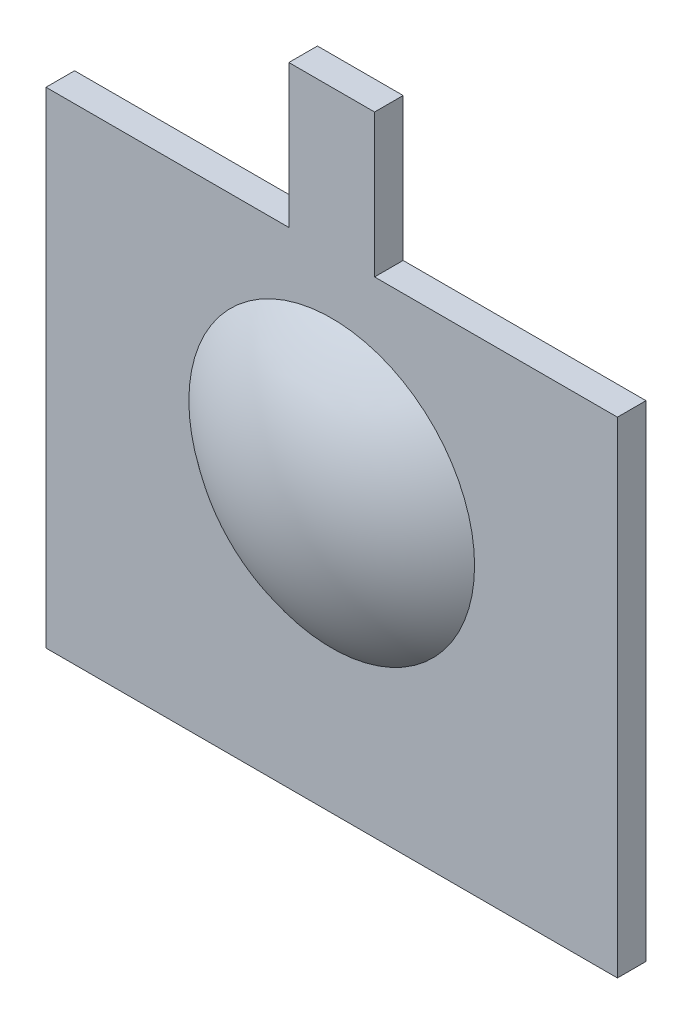
ISO-10303-21;
HEADER;
FILE_DESCRIPTION(('STEP AP214'),'2;1');
FILE_NAME('part.step','',(''),(''),'','','');
FILE_SCHEMA(('AUTOMOTIVE_DESIGN { 1 0 10303 214 1 1 1 1 }'));
ENDSEC;
DATA;
#1=APPLICATION_CONTEXT('core data for automotive mechanical design processes');
#2=APPLICATION_PROTOCOL_DEFINITION('international standard','automotive_design',2000,#1);
#3=PRODUCT_CONTEXT('',#1,'mechanical');
#4=PRODUCT('Part','Part','',(#3));
#5=PRODUCT_RELATED_PRODUCT_CATEGORY('part','',(#4));
#6=PRODUCT_DEFINITION_FORMATION('','',#4);
#7=PRODUCT_DEFINITION_CONTEXT('part definition',#1,'design');
#8=PRODUCT_DEFINITION('design','',#6,#7);
#9=PRODUCT_DEFINITION_SHAPE('','',#8);
#10=(LENGTH_UNIT() NAMED_UNIT(*) SI_UNIT(.MILLI.,.METRE.));
#11=(NAMED_UNIT(*) PLANE_ANGLE_UNIT() SI_UNIT($,.RADIAN.));
#12=(NAMED_UNIT(*) SI_UNIT($,.STERADIAN.) SOLID_ANGLE_UNIT());
#13=UNCERTAINTY_MEASURE_WITH_UNIT(LENGTH_MEASURE(1.E-05),#10,'distance_accuracy_value','');
#14=(GEOMETRIC_REPRESENTATION_CONTEXT(3) GLOBAL_UNCERTAINTY_ASSIGNED_CONTEXT((#13)) GLOBAL_UNIT_ASSIGNED_CONTEXT((#10,
#11,#12)) REPRESENTATION_CONTEXT('',''));
#15=CARTESIAN_POINT('',(0.,0.,0.));
#16=DIRECTION('',(0.,0.,1.));
#17=DIRECTION('',(1.,0.,0.));
#18=AXIS2_PLACEMENT_3D('',#15,#16,#17);
#19=CARTESIAN_POINT('',(0.,10.45,0.));
#20=DIRECTION('',(0.,1.,0.));
#21=DIRECTION('',(0.,0.,1.));
#22=AXIS2_PLACEMENT_3D('',#19,#20,#21);
#23=PLANE('',#22);
#24=DIRECTION('',(0.,0.,1.));
#25=VECTOR('',#24,1.);
#26=CARTESIAN_POINT('',(13.55,10.45,-65.35));
#27=LINE('',#26,#25);
#28=CARTESIAN_POINT('',(13.55,10.45,-65.35));
#29=VERTEX_POINT('',#28);
#30=CARTESIAN_POINT('',(13.55,10.45,-64.85));
#31=VERTEX_POINT('',#30);
#32=EDGE_CURVE('E56',#29,#31,#27,.T.);
#33=ORIENTED_EDGE('',*,*,#32,.F.);
#34=DIRECTION('',(-1.,0.,0.));
#35=VECTOR('',#34,1.);
#36=CARTESIAN_POINT('',(19.3,10.45,-65.35));
#37=LINE('',#36,#35);
#38=CARTESIAN_POINT('',(9.3,10.45,-65.35));
#39=VERTEX_POINT('',#38);
#40=EDGE_CURVE('E145',#29,#39,#37,.T.);
#41=ORIENTED_EDGE('',*,*,#40,.T.);
#42=DIRECTION('',(0.,0.,1.));
#43=VECTOR('',#42,1.);
#44=CARTESIAN_POINT('',(9.3,10.45,-65.35));
#45=LINE('',#44,#43);
#46=CARTESIAN_POINT('',(9.3,10.45,-64.85));
#47=VERTEX_POINT('',#46);
#48=EDGE_CURVE('E136',#39,#47,#45,.T.);
#49=ORIENTED_EDGE('',*,*,#48,.T.);
#50=DIRECTION('',(1.,0.,0.));
#51=VECTOR('',#50,1.);
#52=CARTESIAN_POINT('',(9.3,10.45,-64.85));
#53=LINE('',#52,#51);
#54=EDGE_CURVE('E141',#47,#31,#53,.T.);
#55=ORIENTED_EDGE('',*,*,#54,.T.);
#56=EDGE_LOOP('',(#33,#41,#49,#55));
#57=FACE_BOUND('',#56,.T.);
#58=ADVANCED_FACE('F41',(#57),#23,.T.);
#59=CARTESIAN_POINT('',(9.3,10.45,-65.35));
#60=DIRECTION('',(1.,0.,0.));
#61=DIRECTION('',(0.,0.,-1.));
#62=AXIS2_PLACEMENT_3D('',#59,#60,#61);
#63=PLANE('',#62);
#64=DIRECTION('',(0.,0.,1.));
#65=VECTOR('',#64,1.);
#66=CARTESIAN_POINT('',(9.3,1.95,-65.35));
#67=LINE('',#66,#65);
#68=CARTESIAN_POINT('',(9.3,1.95,-65.35));
#69=VERTEX_POINT('',#68);
#70=CARTESIAN_POINT('',(9.3,1.95,-64.85));
#71=VERTEX_POINT('',#70);
#72=EDGE_CURVE('E127',#69,#71,#67,.T.);
#73=ORIENTED_EDGE('',*,*,#72,.T.);
#74=DIRECTION('',(0.,-1.,0.));
#75=VECTOR('',#74,1.);
#76=CARTESIAN_POINT('',(9.3,10.45,-64.85));
#77=LINE('',#76,#75);
#78=EDGE_CURVE('E49',#47,#71,#77,.T.);
#79=ORIENTED_EDGE('',*,*,#78,.F.);
#80=ORIENTED_EDGE('',*,*,#48,.F.);
#81=DIRECTION('',(0.,-1.,0.));
#82=VECTOR('',#81,1.);
#83=CARTESIAN_POINT('',(9.3,10.45,-65.35));
#84=LINE('',#83,#82);
#85=EDGE_CURVE('E147',#39,#69,#84,.T.);
#86=ORIENTED_EDGE('',*,*,#85,.T.);
#87=EDGE_LOOP('',(#73,#79,#80,#86));
#88=FACE_BOUND('',#87,.T.);
#89=ADVANCED_FACE('F43',(#88),#63,.F.);
#90=CARTESIAN_POINT('',(9.3,10.45,-64.85));
#91=DIRECTION('',(0.,0.,-1.));
#92=DIRECTION('',(-1.,0.,0.));
#93=AXIS2_PLACEMENT_3D('',#90,#91,#92);
#94=PLANE('',#93);
#95=CARTESIAN_POINT('',(14.3,6.95,-64.85));
#96=DIRECTION('',(0.,0.,-1.));
#97=DIRECTION('',(-1.,0.,0.));
#98=AXIS2_PLACEMENT_3D('',#95,#96,#97);
#99=CIRCLE('',#98,2.50000000000002);
#100=CARTESIAN_POINT('',(11.8,6.95,-64.85));
#101=VERTEX_POINT('',#100);
#102=EDGE_CURVE('E11',#101,#101,#99,.F.);
#103=ORIENTED_EDGE('',*,*,#102,.F.);
#104=EDGE_LOOP('',(#103));
#105=FACE_BOUND('',#104,.T.);
#106=DIRECTION('',(1.,0.,0.));
#107=VECTOR('',#106,1.);
#108=CARTESIAN_POINT('',(9.3,1.95,-64.85));
#109=LINE('',#108,#107);
#110=CARTESIAN_POINT('',(19.3,1.95,-64.85));
#111=VERTEX_POINT('',#110);
#112=EDGE_CURVE('E130',#71,#111,#109,.T.);
#113=ORIENTED_EDGE('',*,*,#112,.T.);
#114=DIRECTION('',(0.,-1.,0.));
#115=VECTOR('',#114,1.);
#116=CARTESIAN_POINT('',(19.3,10.45,-64.85));
#117=LINE('',#116,#115);
#118=CARTESIAN_POINT('',(19.3,10.45,-64.85));
#119=VERTEX_POINT('',#118);
#120=EDGE_CURVE('E158',#119,#111,#117,.T.);
#121=ORIENTED_EDGE('',*,*,#120,.F.);
#122=CARTESIAN_POINT('',(15.05,10.45,-64.85));
#123=VERTEX_POINT('',#122);
#124=EDGE_CURVE('E139',#123,#119,#53,.T.);
#125=ORIENTED_EDGE('',*,*,#124,.F.);
#126=DIRECTION('',(0.,-1.,0.));
#127=VECTOR('',#126,1.);
#128=CARTESIAN_POINT('',(15.05,12.95,-64.85));
#129=LINE('',#128,#127);
#130=CARTESIAN_POINT('',(15.05,12.95,-64.85));
#131=VERTEX_POINT('',#130);
#132=EDGE_CURVE('E112',#131,#123,#129,.T.);
#133=ORIENTED_EDGE('',*,*,#132,.F.);
#134=DIRECTION('',(1.,0.,0.));
#135=VECTOR('',#134,1.);
#136=CARTESIAN_POINT('',(13.55,12.95,-64.85));
#137=LINE('',#136,#135);
#138=CARTESIAN_POINT('',(13.55,12.95,-64.85));
#139=VERTEX_POINT('',#138);
#140=EDGE_CURVE('E106',#139,#131,#137,.T.);
#141=ORIENTED_EDGE('',*,*,#140,.F.);
#142=DIRECTION('',(0.,-1.,0.));
#143=VECTOR('',#142,1.);
#144=CARTESIAN_POINT('',(13.55,12.95,-64.85));
#145=LINE('',#144,#143);
#146=EDGE_CURVE('E110',#139,#31,#145,.T.);
#147=ORIENTED_EDGE('',*,*,#146,.T.);
#148=ORIENTED_EDGE('',*,*,#54,.F.);
#149=ORIENTED_EDGE('',*,*,#78,.T.);
#150=EDGE_LOOP('',(#113,#121,#125,#133,#141,#147,#148,#149));
#151=FACE_BOUND('',#150,.T.);
#152=ADVANCED_FACE('F108',(#105,#151),#94,.F.);
#153=CARTESIAN_POINT('',(19.3,10.45,-64.85));
#154=DIRECTION('',(-1.,0.,0.));
#155=DIRECTION('',(0.,0.,1.));
#156=AXIS2_PLACEMENT_3D('',#153,#154,#155);
#157=PLANE('',#156);
#158=DIRECTION('',(0.,0.,-1.));
#159=VECTOR('',#158,1.);
#160=CARTESIAN_POINT('',(19.3,1.95,-64.85));
#161=LINE('',#160,#159);
#162=CARTESIAN_POINT('',(19.3,1.95,-65.35));
#163=VERTEX_POINT('',#162);
#164=EDGE_CURVE('E150',#111,#163,#161,.T.);
#165=ORIENTED_EDGE('',*,*,#164,.T.);
#166=DIRECTION('',(0.,-1.,0.));
#167=VECTOR('',#166,1.);
#168=CARTESIAN_POINT('',(19.3,10.45,-65.35));
#169=LINE('',#168,#167);
#170=CARTESIAN_POINT('',(19.3,10.45,-65.35));
#171=VERTEX_POINT('',#170);
#172=EDGE_CURVE('E155',#171,#163,#169,.T.);
#173=ORIENTED_EDGE('',*,*,#172,.F.);
#174=DIRECTION('',(0.,0.,-1.));
#175=VECTOR('',#174,1.);
#176=CARTESIAN_POINT('',(19.3,10.45,-64.85));
#177=LINE('',#176,#175);
#178=EDGE_CURVE('E143',#119,#171,#177,.T.);
#179=ORIENTED_EDGE('',*,*,#178,.F.);
#180=ORIENTED_EDGE('',*,*,#120,.T.);
#181=EDGE_LOOP('',(#165,#173,#179,#180));
#182=FACE_BOUND('',#181,.T.);
#183=ADVANCED_FACE('F173',(#182),#157,.F.);
#184=CARTESIAN_POINT('',(19.3,10.45,-65.35));
#185=DIRECTION('',(0.,0.,1.));
#186=DIRECTION('',(1.,0.,0.));
#187=AXIS2_PLACEMENT_3D('',#184,#185,#186);
#188=PLANE('',#187);
#189=DIRECTION('',(-1.,0.,0.));
#190=VECTOR('',#189,1.);
#191=CARTESIAN_POINT('',(19.3,1.95,-65.35));
#192=LINE('',#191,#190);
#193=EDGE_CURVE('E140',#163,#69,#192,.T.);
#194=ORIENTED_EDGE('',*,*,#193,.T.);
#195=ORIENTED_EDGE('',*,*,#85,.F.);
#196=ORIENTED_EDGE('',*,*,#40,.F.);
#197=DIRECTION('',(0.,-1.,0.));
#198=VECTOR('',#197,1.);
#199=CARTESIAN_POINT('',(13.55,12.95,-65.35));
#200=LINE('',#199,#198);
#201=CARTESIAN_POINT('',(13.55,12.95,-65.35));
#202=VERTEX_POINT('',#201);
#203=EDGE_CURVE('E187',#202,#29,#200,.T.);
#204=ORIENTED_EDGE('',*,*,#203,.F.);
#205=DIRECTION('',(-1.,0.,0.));
#206=VECTOR('',#205,1.);
#207=CARTESIAN_POINT('',(15.05,12.95,-65.35));
#208=LINE('',#207,#206);
#209=CARTESIAN_POINT('',(15.05,12.95,-65.35));
#210=VERTEX_POINT('',#209);
#211=EDGE_CURVE('E121',#210,#202,#208,.T.);
#212=ORIENTED_EDGE('',*,*,#211,.F.);
#213=DIRECTION('',(0.,-1.,0.));
#214=VECTOR('',#213,1.);
#215=CARTESIAN_POINT('',(15.05,12.95,-65.35));
#216=LINE('',#215,#214);
#217=CARTESIAN_POINT('',(15.05,10.45,-65.35));
#218=VERTEX_POINT('',#217);
#219=EDGE_CURVE('E132',#210,#218,#216,.T.);
#220=ORIENTED_EDGE('',*,*,#219,.T.);
#221=EDGE_CURVE('E146',#171,#218,#37,.T.);
#222=ORIENTED_EDGE('',*,*,#221,.F.);
#223=ORIENTED_EDGE('',*,*,#172,.T.);
#224=EDGE_LOOP('',(#194,#195,#196,#204,#212,#220,#222,#223));
#225=FACE_BOUND('',#224,.T.);
#226=ADVANCED_FACE('F177',(#225),#188,.F.);
#227=DIRECTION('',(0.,0.,-1.));
#228=VECTOR('',#227,1.);
#229=CARTESIAN_POINT('',(15.05,10.45,-64.85));
#230=LINE('',#229,#228);
#231=EDGE_CURVE('E64',#123,#218,#230,.T.);
#232=ORIENTED_EDGE('',*,*,#231,.F.);
#233=ORIENTED_EDGE('',*,*,#124,.T.);
#234=ORIENTED_EDGE('',*,*,#178,.T.);
#235=ORIENTED_EDGE('',*,*,#221,.T.);
#236=EDGE_LOOP('',(#232,#233,#234,#235));
#237=FACE_BOUND('',#236,.T.);
#238=ADVANCED_FACE('F180',(#237),#23,.T.);
#239=CARTESIAN_POINT('',(0.,1.95,0.));
#240=DIRECTION('',(0.,1.,0.));
#241=DIRECTION('',(0.,0.,1.));
#242=AXIS2_PLACEMENT_3D('',#239,#240,#241);
#243=PLANE('',#242);
#244=ORIENTED_EDGE('',*,*,#72,.F.);
#245=ORIENTED_EDGE('',*,*,#193,.F.);
#246=ORIENTED_EDGE('',*,*,#164,.F.);
#247=ORIENTED_EDGE('',*,*,#112,.F.);
#248=EDGE_LOOP('',(#244,#245,#246,#247));
#249=FACE_BOUND('',#248,.T.);
#250=ADVANCED_FACE('F169',(#249),#243,.F.);
#251=CARTESIAN_POINT('',(13.55,12.95,-65.35));
#252=DIRECTION('',(1.,0.,0.));
#253=DIRECTION('',(0.,0.,-1.));
#254=AXIS2_PLACEMENT_3D('',#251,#252,#253);
#255=PLANE('',#254);
#256=ORIENTED_EDGE('',*,*,#32,.T.);
#257=ORIENTED_EDGE('',*,*,#146,.F.);
#258=DIRECTION('',(0.,0.,1.));
#259=VECTOR('',#258,1.);
#260=CARTESIAN_POINT('',(13.55,12.95,-65.35));
#261=LINE('',#260,#259);
#262=EDGE_CURVE('E116',#202,#139,#261,.T.);
#263=ORIENTED_EDGE('',*,*,#262,.F.);
#264=ORIENTED_EDGE('',*,*,#203,.T.);
#265=EDGE_LOOP('',(#256,#257,#263,#264));
#266=FACE_BOUND('',#265,.T.);
#267=ADVANCED_FACE('F126',(#266),#255,.F.);
#268=CARTESIAN_POINT('',(15.05,12.95,-64.85));
#269=DIRECTION('',(-1.,0.,0.));
#270=DIRECTION('',(0.,0.,1.));
#271=AXIS2_PLACEMENT_3D('',#268,#269,#270);
#272=PLANE('',#271);
#273=ORIENTED_EDGE('',*,*,#231,.T.);
#274=ORIENTED_EDGE('',*,*,#219,.F.);
#275=DIRECTION('',(0.,0.,-1.));
#276=VECTOR('',#275,1.);
#277=CARTESIAN_POINT('',(15.05,12.95,-64.85));
#278=LINE('',#277,#276);
#279=EDGE_CURVE('E115',#131,#210,#278,.T.);
#280=ORIENTED_EDGE('',*,*,#279,.F.);
#281=ORIENTED_EDGE('',*,*,#132,.T.);
#282=EDGE_LOOP('',(#273,#274,#280,#281));
#283=FACE_BOUND('',#282,.T.);
#284=ADVANCED_FACE('F182',(#283),#272,.F.);
#285=CARTESIAN_POINT('',(0.,12.95,0.));
#286=DIRECTION('',(0.,1.,0.));
#287=DIRECTION('',(0.,0.,1.));
#288=AXIS2_PLACEMENT_3D('',#285,#286,#287);
#289=PLANE('',#288);
#290=ORIENTED_EDGE('',*,*,#262,.T.);
#291=ORIENTED_EDGE('',*,*,#140,.T.);
#292=ORIENTED_EDGE('',*,*,#279,.T.);
#293=ORIENTED_EDGE('',*,*,#211,.T.);
#294=EDGE_LOOP('',(#290,#291,#292,#293));
#295=FACE_BOUND('',#294,.T.);
#296=ADVANCED_FACE('F119',(#295),#289,.T.);
#297=CARTESIAN_POINT('',(14.3,6.95,-67.8722222222223));
#298=DIRECTION('',(0.,0.,-1.));
#299=DIRECTION('',(1.,0.,0.));
#300=AXIS2_PLACEMENT_3D('',#297,#298,#299);
#301=SPHERICAL_SURFACE('',#300,3.92222222222227);
#302=ORIENTED_EDGE('',*,*,#102,.T.);
#303=EDGE_LOOP('',(#302));
#304=FACE_BOUND('',#303,.T.);
#305=ADVANCED_FACE('F215',(#304),#301,.T.);
#306=CLOSED_SHELL('',(#58,#89,#152,#183,#226,#238,#250,#267,#284,#296,#305));
#307=MANIFOLD_SOLID_BREP('B2',#306);
#308=ADVANCED_BREP_SHAPE_REPRESENTATION('',(#18,#307),#14);
#309=SHAPE_DEFINITION_REPRESENTATION(#9,#308);
ENDSEC;
END-ISO-10303-21;
